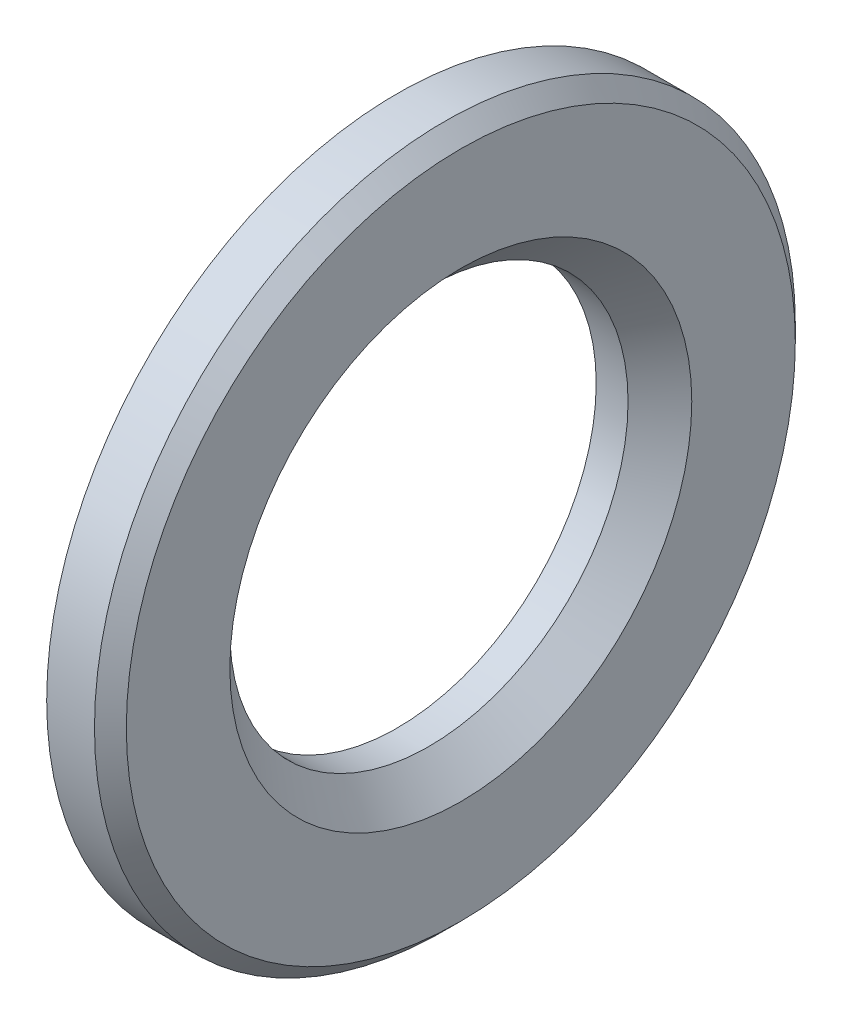
ISO-10303-21;
HEADER;
FILE_DESCRIPTION(('STEP AP214'),'2;1');
FILE_NAME('part.step','',(''),(''),'','','');
FILE_SCHEMA(('AUTOMOTIVE_DESIGN { 1 0 10303 214 1 1 1 1 }'));
ENDSEC;
DATA;
#1=APPLICATION_CONTEXT('core data for automotive mechanical design processes');
#2=APPLICATION_PROTOCOL_DEFINITION('international standard','automotive_design',2000,#1);
#3=PRODUCT_CONTEXT('',#1,'mechanical');
#4=PRODUCT('Part','Part','',(#3));
#5=PRODUCT_RELATED_PRODUCT_CATEGORY('part','',(#4));
#6=PRODUCT_DEFINITION_FORMATION('','',#4);
#7=PRODUCT_DEFINITION_CONTEXT('part definition',#1,'design');
#8=PRODUCT_DEFINITION('design','',#6,#7);
#9=PRODUCT_DEFINITION_SHAPE('','',#8);
#10=(LENGTH_UNIT() NAMED_UNIT(*) SI_UNIT(.MILLI.,.METRE.));
#11=(NAMED_UNIT(*) PLANE_ANGLE_UNIT() SI_UNIT($,.RADIAN.));
#12=(NAMED_UNIT(*) SI_UNIT($,.STERADIAN.) SOLID_ANGLE_UNIT());
#13=UNCERTAINTY_MEASURE_WITH_UNIT(LENGTH_MEASURE(1.E-05),#10,'distance_accuracy_value','');
#14=(GEOMETRIC_REPRESENTATION_CONTEXT(3) GLOBAL_UNCERTAINTY_ASSIGNED_CONTEXT((#13)) GLOBAL_UNIT_ASSIGNED_CONTEXT((#10,
#11,#12)) REPRESENTATION_CONTEXT('',''));
#15=CARTESIAN_POINT('',(0.,0.,0.));
#16=DIRECTION('',(0.,0.,1.));
#17=DIRECTION('',(1.,0.,0.));
#18=AXIS2_PLACEMENT_3D('',#15,#16,#17);
#19=CARTESIAN_POINT('',(4.,0.,0.));
#20=DIRECTION('',(1.,0.,0.));
#21=DIRECTION('',(0.,0.,-1.));
#22=AXIS2_PLACEMENT_3D('',#19,#20,#21);
#23=PLANE('',#22);
#24=CARTESIAN_POINT('',(4.,0.,0.));
#25=DIRECTION('',(1.,0.,0.));
#26=DIRECTION('',(0.,0.,-1.));
#27=AXIS2_PLACEMENT_3D('',#24,#25,#26);
#28=CIRCLE('',#27,21.);
#29=CARTESIAN_POINT('',(4.,0.,-21.));
#30=VERTEX_POINT('',#29);
#31=EDGE_CURVE('E37',#30,#30,#28,.T.);
#32=ORIENTED_EDGE('',*,*,#31,.T.);
#33=EDGE_LOOP('',(#32));
#34=FACE_BOUND('',#33,.T.);
#35=CARTESIAN_POINT('',(4.,0.,0.));
#36=DIRECTION('',(1.,0.,0.));
#37=DIRECTION('',(0.,0.,-1.));
#38=AXIS2_PLACEMENT_3D('',#35,#36,#37);
#39=CIRCLE('',#38,14.5);
#40=CARTESIAN_POINT('',(4.,0.,-14.5));
#41=VERTEX_POINT('',#40);
#42=EDGE_CURVE('E41',#41,#41,#39,.F.);
#43=ORIENTED_EDGE('',*,*,#42,.T.);
#44=EDGE_LOOP('',(#43));
#45=FACE_BOUND('',#44,.T.);
#46=ADVANCED_FACE('F30',(#34,#45),#23,.T.);
#47=CARTESIAN_POINT('',(0.,0.,0.));
#48=DIRECTION('',(1.,0.,0.));
#49=DIRECTION('',(0.,0.,-1.));
#50=AXIS2_PLACEMENT_3D('',#47,#48,#49);
#51=PLANE('',#50);
#52=CARTESIAN_POINT('',(0.,0.,0.));
#53=DIRECTION('',(1.,0.,0.));
#54=DIRECTION('',(0.,0.,-1.));
#55=AXIS2_PLACEMENT_3D('',#52,#53,#54);
#56=CIRCLE('',#55,22.);
#57=CARTESIAN_POINT('',(0.,0.,-22.));
#58=VERTEX_POINT('',#57);
#59=EDGE_CURVE('E50',#58,#58,#56,.T.);
#60=ORIENTED_EDGE('',*,*,#59,.F.);
#61=EDGE_LOOP('',(#60));
#62=FACE_BOUND('',#61,.T.);
#63=CARTESIAN_POINT('',(0.,0.,0.));
#64=DIRECTION('',(1.,0.,0.));
#65=DIRECTION('',(0.,0.,-1.));
#66=AXIS2_PLACEMENT_3D('',#63,#64,#65);
#67=CIRCLE('',#66,12.5);
#68=CARTESIAN_POINT('',(0.,0.,-12.5));
#69=VERTEX_POINT('',#68);
#70=EDGE_CURVE('E53',#69,#69,#67,.T.);
#71=ORIENTED_EDGE('',*,*,#70,.T.);
#72=EDGE_LOOP('',(#71));
#73=FACE_BOUND('',#72,.T.);
#74=ADVANCED_FACE('F57',(#62,#73),#51,.F.);
#75=CARTESIAN_POINT('',(4.,0.,0.));
#76=DIRECTION('',(-1.,0.,0.));
#77=DIRECTION('',(0.,0.,1.));
#78=AXIS2_PLACEMENT_3D('',#75,#76,#77);
#79=CYLINDRICAL_SURFACE('',#78,22.);
#80=CARTESIAN_POINT('',(3.,0.,0.));
#81=DIRECTION('',(1.,0.,0.));
#82=DIRECTION('',(0.,0.,-1.));
#83=AXIS2_PLACEMENT_3D('',#80,#81,#82);
#84=CIRCLE('',#83,22.);
#85=CARTESIAN_POINT('',(3.,0.,-22.));
#86=VERTEX_POINT('',#85);
#87=EDGE_CURVE('E10',#86,#86,#84,.F.);
#88=ORIENTED_EDGE('',*,*,#87,.T.);
#89=EDGE_LOOP('',(#88));
#90=FACE_BOUND('',#89,.T.);
#91=ORIENTED_EDGE('',*,*,#59,.T.);
#92=EDGE_LOOP('',(#91));
#93=FACE_BOUND('',#92,.T.);
#94=ADVANCED_FACE('F62',(#90,#93),#79,.T.);
#95=CARTESIAN_POINT('',(4.,0.,0.));
#96=DIRECTION('',(-1.,0.,0.));
#97=DIRECTION('',(0.,0.,1.));
#98=AXIS2_PLACEMENT_3D('',#95,#96,#97);
#99=CYLINDRICAL_SURFACE('',#98,12.5);
#100=CARTESIAN_POINT('',(2.,0.,0.));
#101=DIRECTION('',(1.,0.,0.));
#102=DIRECTION('',(0.,0.,-1.));
#103=AXIS2_PLACEMENT_3D('',#100,#101,#102);
#104=CIRCLE('',#103,12.5);
#105=CARTESIAN_POINT('',(2.,0.,-12.5));
#106=VERTEX_POINT('',#105);
#107=EDGE_CURVE('E45',#106,#106,#104,.T.);
#108=ORIENTED_EDGE('',*,*,#107,.T.);
#109=EDGE_LOOP('',(#108));
#110=FACE_BOUND('',#109,.T.);
#111=ORIENTED_EDGE('',*,*,#70,.F.);
#112=EDGE_LOOP('',(#111));
#113=FACE_BOUND('',#112,.T.);
#114=ADVANCED_FACE('F59',(#110,#113),#99,.F.);
#115=CARTESIAN_POINT('',(2.,0.,0.));
#116=DIRECTION('',(1.,0.,0.));
#117=DIRECTION('',(0.,0.,-1.));
#118=AXIS2_PLACEMENT_3D('',#115,#116,#117);
#119=CONICAL_SURFACE('',#118,12.5,0.78539816339745);
#120=ORIENTED_EDGE('',*,*,#42,.F.);
#121=EDGE_LOOP('',(#120));
#122=FACE_BOUND('',#121,.T.);
#123=ORIENTED_EDGE('',*,*,#107,.F.);
#124=EDGE_LOOP('',(#123));
#125=FACE_BOUND('',#124,.T.);
#126=ADVANCED_FACE('F61',(#122,#125),#119,.F.);
#127=CARTESIAN_POINT('',(4.,0.,0.));
#128=DIRECTION('',(-1.,0.,0.));
#129=DIRECTION('',(0.,0.,1.));
#130=AXIS2_PLACEMENT_3D('',#127,#128,#129);
#131=CONICAL_SURFACE('',#130,21.,0.785398163397447);
#132=ORIENTED_EDGE('',*,*,#87,.F.);
#133=EDGE_LOOP('',(#132));
#134=FACE_BOUND('',#133,.T.);
#135=ORIENTED_EDGE('',*,*,#31,.F.);
#136=EDGE_LOOP('',(#135));
#137=FACE_BOUND('',#136,.T.);
#138=ADVANCED_FACE('F32',(#134,#137),#131,.T.);
#139=CLOSED_SHELL('',(#46,#74,#94,#114,#126,#138));
#140=MANIFOLD_SOLID_BREP('B2',#139);
#141=ADVANCED_BREP_SHAPE_REPRESENTATION('',(#18,#140),#14);
#142=SHAPE_DEFINITION_REPRESENTATION(#9,#141);
ENDSEC;
END-ISO-10303-21;
